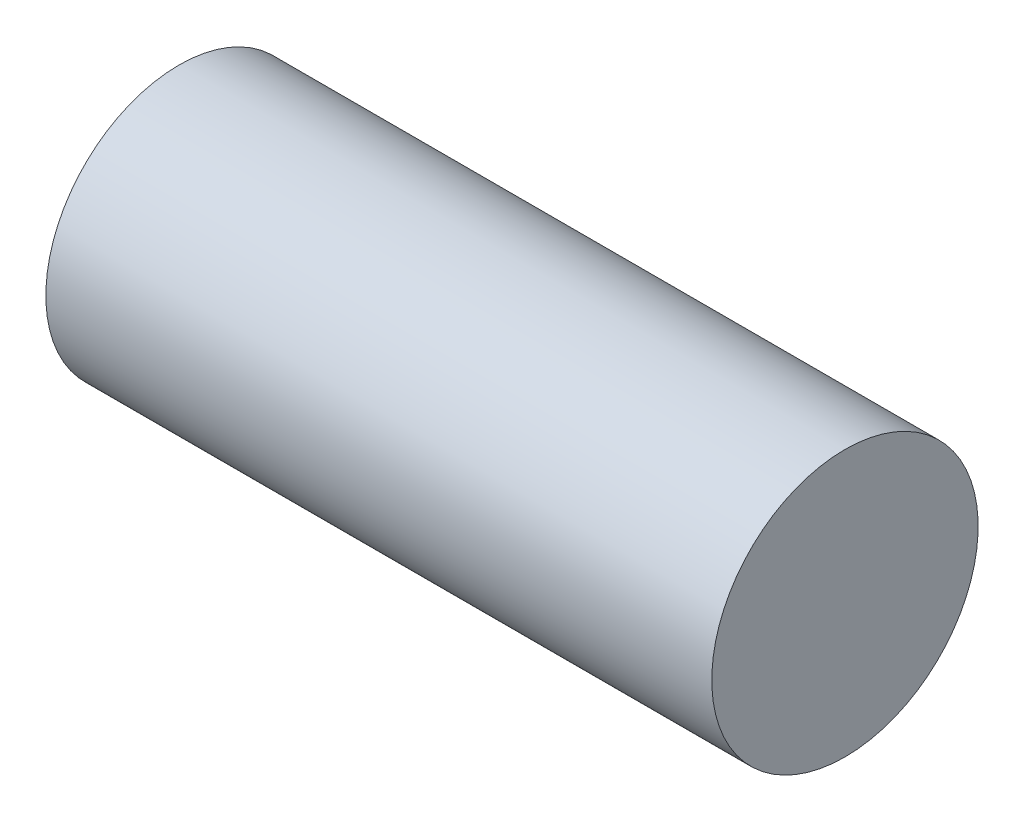
ISO-10303-21;
HEADER;
FILE_DESCRIPTION(('STEP AP214'),'2;1');
FILE_NAME('part.step','',(''),(''),'','','');
FILE_SCHEMA(('AUTOMOTIVE_DESIGN { 1 0 10303 214 1 1 1 1 }'));
ENDSEC;
DATA;
#1=APPLICATION_CONTEXT('core data for automotive mechanical design processes');
#2=APPLICATION_PROTOCOL_DEFINITION('international standard','automotive_design',2000,#1);
#3=PRODUCT_CONTEXT('',#1,'mechanical');
#4=PRODUCT('Part','Part','',(#3));
#5=PRODUCT_RELATED_PRODUCT_CATEGORY('part','',(#4));
#6=PRODUCT_DEFINITION_FORMATION('','',#4);
#7=PRODUCT_DEFINITION_CONTEXT('part definition',#1,'design');
#8=PRODUCT_DEFINITION('design','',#6,#7);
#9=PRODUCT_DEFINITION_SHAPE('','',#8);
#10=(LENGTH_UNIT() NAMED_UNIT(*) SI_UNIT(.MILLI.,.METRE.));
#11=(NAMED_UNIT(*) PLANE_ANGLE_UNIT() SI_UNIT($,.RADIAN.));
#12=(NAMED_UNIT(*) SI_UNIT($,.STERADIAN.) SOLID_ANGLE_UNIT());
#13=UNCERTAINTY_MEASURE_WITH_UNIT(LENGTH_MEASURE(1.E-05),#10,'distance_accuracy_value','');
#14=(GEOMETRIC_REPRESENTATION_CONTEXT(3) GLOBAL_UNCERTAINTY_ASSIGNED_CONTEXT((#13)) GLOBAL_UNIT_ASSIGNED_CONTEXT((#10,
#11,#12)) REPRESENTATION_CONTEXT('',''));
#15=CARTESIAN_POINT('',(0.,0.,0.));
#16=DIRECTION('',(0.,0.,1.));
#17=DIRECTION('',(1.,0.,0.));
#18=AXIS2_PLACEMENT_3D('',#15,#16,#17);
#19=CARTESIAN_POINT('',(0.,0.,0.));
#20=DIRECTION('',(1.,0.,0.));
#21=DIRECTION('',(0.,1.,0.));
#22=AXIS2_PLACEMENT_3D('',#19,#20,#21);
#23=PLANE('',#22);
#24=CARTESIAN_POINT('',(0.,0.,0.));
#25=DIRECTION('',(1.,0.,0.));
#26=DIRECTION('',(0.,1.,0.));
#27=AXIS2_PLACEMENT_3D('',#24,#25,#26);
#28=CIRCLE('',#27,60.);
#29=CARTESIAN_POINT('',(0.,60.,0.));
#30=VERTEX_POINT('',#29);
#31=EDGE_CURVE('E10',#30,#30,#28,.T.);
#32=ORIENTED_EDGE('',*,*,#31,.F.);
#33=EDGE_LOOP('',(#32));
#34=FACE_BOUND('',#33,.T.);
#35=ADVANCED_FACE('F33',(#34),#23,.F.);
#36=CARTESIAN_POINT('',(10.,0.,0.));
#37=DIRECTION('',(1.,0.,0.));
#38=DIRECTION('',(0.,1.,0.));
#39=AXIS2_PLACEMENT_3D('',#36,#37,#38);
#40=CYLINDRICAL_SURFACE('',#39,60.);
#41=CARTESIAN_POINT('',(300.,0.,0.));
#42=DIRECTION('',(1.,0.,0.));
#43=DIRECTION('',(0.,1.,0.));
#44=AXIS2_PLACEMENT_3D('',#41,#42,#43);
#45=CIRCLE('',#44,60.);
#46=CARTESIAN_POINT('',(300.,59.9999999999999,0.));
#47=VERTEX_POINT('',#46);
#48=EDGE_CURVE('E41',#47,#47,#45,.T.);
#49=ORIENTED_EDGE('',*,*,#48,.F.);
#50=EDGE_LOOP('',(#49));
#51=FACE_BOUND('',#50,.T.);
#52=ORIENTED_EDGE('',*,*,#31,.T.);
#53=EDGE_LOOP('',(#52));
#54=FACE_BOUND('',#53,.T.);
#55=ADVANCED_FACE('F111',(#51,#54),#40,.T.);
#56=CARTESIAN_POINT('',(300.,0.,0.));
#57=DIRECTION('',(1.,0.,0.));
#58=DIRECTION('',(0.,1.,0.));
#59=AXIS2_PLACEMENT_3D('',#56,#57,#58);
#60=PLANE('',#59);
#61=ORIENTED_EDGE('',*,*,#48,.T.);
#62=EDGE_LOOP('',(#61));
#63=FACE_BOUND('',#62,.T.);
#64=ADVANCED_FACE('F109',(#63),#60,.T.);
#65=CLOSED_SHELL('',(#35,#55,#64));
#66=CARTESIAN_POINT('',(10.,0.,0.));
#67=DIRECTION('',(-1.,0.,0.));
#68=DIRECTION('',(0.,-1.,0.));
#69=AXIS2_PLACEMENT_3D('',#66,#67,#68);
#70=PLANE('',#69);
#71=CARTESIAN_POINT('',(10.,0.,0.));
#72=DIRECTION('',(1.,0.,0.));
#73=DIRECTION('',(0.,1.,0.));
#74=AXIS2_PLACEMENT_3D('',#71,#72,#73);
#75=CIRCLE('',#74,50.);
#76=CARTESIAN_POINT('',(10.,50.,0.));
#77=VERTEX_POINT('',#76);
#78=EDGE_CURVE('E63',#77,#77,#75,.T.);
#79=ORIENTED_EDGE('',*,*,#78,.T.);
#80=EDGE_LOOP('',(#79));
#81=FACE_BOUND('',#80,.T.);
#82=ADVANCED_FACE('F35',(#81),#70,.F.);
#83=CARTESIAN_POINT('',(290.,0.,0.));
#84=DIRECTION('',(-1.,0.,0.));
#85=DIRECTION('',(0.,-1.,0.));
#86=AXIS2_PLACEMENT_3D('',#83,#84,#85);
#87=PLANE('',#86);
#88=CARTESIAN_POINT('',(290.,0.,0.));
#89=DIRECTION('',(1.,0.,0.));
#90=DIRECTION('',(0.,1.,0.));
#91=AXIS2_PLACEMENT_3D('',#88,#89,#90);
#92=CIRCLE('',#91,50.);
#93=CARTESIAN_POINT('',(290.,50.,0.));
#94=VERTEX_POINT('',#93);
#95=EDGE_CURVE('E45',#94,#94,#92,.T.);
#96=ORIENTED_EDGE('',*,*,#95,.F.);
#97=EDGE_LOOP('',(#96));
#98=FACE_BOUND('',#97,.T.);
#99=ADVANCED_FACE('F95',(#98),#87,.T.);
#100=CARTESIAN_POINT('',(10.,0.,0.));
#101=DIRECTION('',(1.,0.,0.));
#102=DIRECTION('',(0.,1.,0.));
#103=AXIS2_PLACEMENT_3D('',#100,#101,#102);
#104=CYLINDRICAL_SURFACE('',#103,50.);
#105=ORIENTED_EDGE('',*,*,#95,.T.);
#106=EDGE_LOOP('',(#105));
#107=FACE_BOUND('',#106,.T.);
#108=CARTESIAN_POINT('',(200.,0.,0.));
#109=DIRECTION('',(1.,0.,0.));
#110=DIRECTION('',(0.,1.,0.));
#111=AXIS2_PLACEMENT_3D('',#108,#109,#110);
#112=CIRCLE('',#111,50.);
#113=CARTESIAN_POINT('',(200.,50.,0.));
#114=VERTEX_POINT('',#113);
#115=EDGE_CURVE('E49',#114,#114,#112,.T.);
#116=ORIENTED_EDGE('',*,*,#115,.F.);
#117=EDGE_LOOP('',(#116));
#118=FACE_BOUND('',#117,.T.);
#119=ADVANCED_FACE('F89',(#107,#118),#104,.F.);
#120=CARTESIAN_POINT('',(160.,0.,0.));
#121=DIRECTION('',(1.,0.,0.));
#122=DIRECTION('',(0.,1.,0.));
#123=AXIS2_PLACEMENT_3D('',#120,#121,#122);
#124=CONICAL_SURFACE('',#123,9.99999999999998,0.78539816339745);
#125=CARTESIAN_POINT('',(160.,0.,0.));
#126=DIRECTION('',(1.,0.,0.));
#127=DIRECTION('',(0.,1.,0.));
#128=AXIS2_PLACEMENT_3D('',#125,#126,#127);
#129=CIRCLE('',#128,9.99999999999998);
#130=CARTESIAN_POINT('',(160.,9.99999999999998,0.));
#131=VERTEX_POINT('',#130);
#132=EDGE_CURVE('E54',#131,#131,#129,.T.);
#133=CARTESIAN_POINT('',(200.,50.,0.));
#134=CARTESIAN_POINT('',(199.583333333333,49.5833333333333,0.));
#135=CARTESIAN_POINT('',(199.166666666667,49.1666666666666,0.));
#136=CARTESIAN_POINT('',(198.333333333333,48.3333333333333,0.));
#137=CARTESIAN_POINT('',(197.916666666667,47.9166666666666,0.));
#138=CARTESIAN_POINT('',(197.083333333333,47.0833333333333,0.));
#139=CARTESIAN_POINT('',(196.666666666667,46.6666666666666,0.));
#140=CARTESIAN_POINT('',(195.833333333333,45.8333333333333,0.));
#141=CARTESIAN_POINT('',(195.416666666667,45.4166666666666,0.));
#142=CARTESIAN_POINT('',(194.583333333333,44.5833333333333,0.));
#143=CARTESIAN_POINT('',(194.166666666667,44.1666666666666,0.));
#144=CARTESIAN_POINT('',(193.333333333333,43.3333333333333,0.));
#145=CARTESIAN_POINT('',(192.916666666667,42.9166666666666,0.));
#146=CARTESIAN_POINT('',(192.083333333333,42.0833333333333,0.));
#147=CARTESIAN_POINT('',(191.666666666667,41.6666666666666,0.));
#148=CARTESIAN_POINT('',(190.833333333333,40.8333333333333,0.));
#149=CARTESIAN_POINT('',(190.416666666667,40.4166666666666,0.));
#150=CARTESIAN_POINT('',(189.583333333333,39.5833333333333,0.));
#151=CARTESIAN_POINT('',(189.166666666667,39.1666666666666,0.));
#152=CARTESIAN_POINT('',(188.333333333333,38.3333333333333,0.));
#153=CARTESIAN_POINT('',(187.916666666667,37.9166666666667,0.));
#154=CARTESIAN_POINT('',(187.083333333333,37.0833333333333,0.));
#155=CARTESIAN_POINT('',(186.666666666667,36.6666666666666,0.));
#156=CARTESIAN_POINT('',(185.833333333333,35.8333333333333,0.));
#157=CARTESIAN_POINT('',(185.416666666667,35.4166666666666,0.));
#158=CARTESIAN_POINT('',(184.583333333333,34.5833333333333,0.));
#159=CARTESIAN_POINT('',(184.166666666667,34.1666666666666,0.));
#160=CARTESIAN_POINT('',(183.333333333333,33.3333333333333,0.));
#161=CARTESIAN_POINT('',(182.916666666667,32.9166666666666,0.));
#162=CARTESIAN_POINT('',(182.083333333333,32.0833333333333,0.));
#163=CARTESIAN_POINT('',(181.666666666667,31.6666666666666,0.));
#164=CARTESIAN_POINT('',(180.833333333333,30.8333333333333,0.));
#165=CARTESIAN_POINT('',(180.416666666667,30.4166666666666,0.));
#166=CARTESIAN_POINT('',(179.583333333333,29.5833333333333,0.));
#167=CARTESIAN_POINT('',(179.166666666667,29.1666666666666,0.));
#168=CARTESIAN_POINT('',(178.333333333333,28.3333333333333,0.));
#169=CARTESIAN_POINT('',(177.916666666667,27.9166666666666,0.));
#170=CARTESIAN_POINT('',(177.083333333333,27.0833333333333,0.));
#171=CARTESIAN_POINT('',(176.666666666667,26.6666666666666,0.));
#172=CARTESIAN_POINT('',(175.833333333333,25.8333333333333,0.));
#173=CARTESIAN_POINT('',(175.416666666667,25.4166666666666,0.));
#174=CARTESIAN_POINT('',(174.583333333333,24.5833333333333,0.));
#175=CARTESIAN_POINT('',(174.166666666667,24.1666666666666,0.));
#176=CARTESIAN_POINT('',(173.333333333333,23.3333333333333,0.));
#177=CARTESIAN_POINT('',(172.916666666667,22.9166666666666,0.));
#178=CARTESIAN_POINT('',(172.083333333333,22.0833333333333,0.));
#179=CARTESIAN_POINT('',(171.666666666667,21.6666666666666,0.));
#180=CARTESIAN_POINT('',(170.833333333333,20.8333333333333,0.));
#181=CARTESIAN_POINT('',(170.416666666667,20.4166666666666,0.));
#182=CARTESIAN_POINT('',(169.583333333333,19.5833333333333,0.));
#183=CARTESIAN_POINT('',(169.166666666667,19.1666666666666,0.));
#184=CARTESIAN_POINT('',(168.333333333333,18.3333333333333,0.));
#185=CARTESIAN_POINT('',(167.916666666667,17.9166666666666,0.));
#186=CARTESIAN_POINT('',(167.083333333333,17.0833333333333,0.));
#187=CARTESIAN_POINT('',(166.666666666667,16.6666666666666,0.));
#188=CARTESIAN_POINT('',(165.833333333333,15.8333333333333,0.));
#189=CARTESIAN_POINT('',(165.416666666667,15.4166666666666,0.));
#190=CARTESIAN_POINT('',(164.583333333333,14.5833333333333,0.));
#191=CARTESIAN_POINT('',(164.166666666667,14.1666666666666,0.));
#192=CARTESIAN_POINT('',(163.333333333333,13.3333333333333,0.));
#193=CARTESIAN_POINT('',(162.916666666667,12.9166666666666,0.));
#194=CARTESIAN_POINT('',(162.083333333333,12.0833333333333,0.));
#195=CARTESIAN_POINT('',(161.666666666667,11.6666666666666,0.));
#196=CARTESIAN_POINT('',(160.833333333333,10.8333333333333,0.));
#197=CARTESIAN_POINT('',(160.416666666667,10.4166666666666,0.));
#198=CARTESIAN_POINT('',(160.,9.99999999999998,0.));
#199=B_SPLINE_CURVE_WITH_KNOTS('',3,(#133,#134,#135,#136,#137,#138,#139,#140,#141,#142,#143,
#144,#145,#146,#147,#148,#149,#150,#151,#152,#153,#154,#155,#156,#157,#158,#159,#160,#161,#162,
#163,#164,#165,#166,#167,#168,#169,#170,#171,#172,#173,#174,#175,#176,#177,#178,#179,#180,#181,
#182,#183,#184,#185,#186,#187,#188,#189,#190,#191,#192,#193,#194,#195,#196,#197,#198),
.UNSPECIFIED.,.F.,.F.,(4,2,2,2,2,2,2,2,2,2,2,2,2,2,2,2,2,2,2,2,2,2,2,2,2,2,2,2,2,2,2,2,4),(0.,
1.76776695296637,3.53553390593274,5.30330085889911,7.07106781186548,8.83883476483182,
10.6066017177982,12.3743686707646,14.1421356237309,15.9099025766973,17.6776695296636,
19.44543648263,21.2132034355964,22.9809703885627,24.7487373415291,26.5165042944955,
28.2842712474618,30.0520382004282,31.8198051533946,33.5875721063609,35.3553390593273,
37.1231060122937,38.89087296526,40.6586399182264,42.4264068711927,44.1941738241591,
45.9619407771255,47.7297077300919,49.4974746830582,51.2652416360246,53.0330085889909,
54.8007755419573,56.5685424949237),.UNSPECIFIED.);
#200=EDGE_CURVE('BSEAM84',#114,#131,#199,.T.);
#201=ORIENTED_EDGE('',*,*,#115,.T.);
#202=ORIENTED_EDGE('',*,*,#132,.F.);
#203=ORIENTED_EDGE('',*,*,#200,.T.);
#204=ORIENTED_EDGE('',*,*,#200,.F.);
#205=EDGE_LOOP('',(#201,#203,#202,#204));
#206=FACE_BOUND('',#205,.T.);
#207=ADVANCED_FACE('F84',(#206),#124,.F.);
#208=CARTESIAN_POINT('',(10.,0.,0.));
#209=DIRECTION('',(1.,0.,0.));
#210=DIRECTION('',(0.,1.,0.));
#211=AXIS2_PLACEMENT_3D('',#208,#209,#210);
#212=CYLINDRICAL_SURFACE('',#211,9.99999999999998);
#213=CARTESIAN_POINT('',(140.,0.,0.));
#214=DIRECTION('',(1.,0.,0.));
#215=DIRECTION('',(0.,1.,0.));
#216=AXIS2_PLACEMENT_3D('',#213,#214,#215);
#217=CIRCLE('',#216,9.99999999999998);
#218=CARTESIAN_POINT('',(140.,-10.,0.));
#219=VERTEX_POINT('',#218);
#220=EDGE_CURVE('E57',#219,#219,#217,.T.);
#221=ORIENTED_EDGE('',*,*,#220,.F.);
#222=EDGE_LOOP('',(#221));
#223=FACE_BOUND('',#222,.T.);
#224=ORIENTED_EDGE('',*,*,#132,.T.);
#225=EDGE_LOOP('',(#224));
#226=FACE_BOUND('',#225,.T.);
#227=ADVANCED_FACE('F78',(#223,#226),#212,.F.);
#228=CARTESIAN_POINT('',(140.,0.,0.));
#229=DIRECTION('',(-1.,0.,0.));
#230=DIRECTION('',(0.,-1.,0.));
#231=AXIS2_PLACEMENT_3D('',#228,#229,#230);
#232=CONICAL_SURFACE('',#231,9.99999999999998,0.78539816339745);
#233=CARTESIAN_POINT('',(100.,0.,0.));
#234=DIRECTION('',(1.,0.,0.));
#235=DIRECTION('',(0.,1.,0.));
#236=AXIS2_PLACEMENT_3D('',#233,#234,#235);
#237=CIRCLE('',#236,50.);
#238=CARTESIAN_POINT('',(100.,-50.,0.));
#239=VERTEX_POINT('',#238);
#240=EDGE_CURVE('E60',#239,#239,#237,.T.);
#241=CARTESIAN_POINT('',(100.,-50.,0.));
#242=CARTESIAN_POINT('',(100.416666666667,-49.5833333333333,0.));
#243=CARTESIAN_POINT('',(100.833333333333,-49.1666666666667,0.));
#244=CARTESIAN_POINT('',(101.666666666667,-48.3333333333333,0.));
#245=CARTESIAN_POINT('',(102.083333333333,-47.9166666666667,0.));
#246=CARTESIAN_POINT('',(102.916666666667,-47.0833333333333,0.));
#247=CARTESIAN_POINT('',(103.333333333333,-46.6666666666667,0.));
#248=CARTESIAN_POINT('',(104.166666666667,-45.8333333333333,0.));
#249=CARTESIAN_POINT('',(104.583333333333,-45.4166666666667,0.));
#250=CARTESIAN_POINT('',(105.416666666667,-44.5833333333333,0.));
#251=CARTESIAN_POINT('',(105.833333333333,-44.1666666666667,0.));
#252=CARTESIAN_POINT('',(106.666666666667,-43.3333333333333,0.));
#253=CARTESIAN_POINT('',(107.083333333333,-42.9166666666667,0.));
#254=CARTESIAN_POINT('',(107.916666666667,-42.0833333333333,0.));
#255=CARTESIAN_POINT('',(108.333333333333,-41.6666666666667,0.));
#256=CARTESIAN_POINT('',(109.166666666667,-40.8333333333333,0.));
#257=CARTESIAN_POINT('',(109.583333333333,-40.4166666666667,0.));
#258=CARTESIAN_POINT('',(110.416666666667,-39.5833333333333,0.));
#259=CARTESIAN_POINT('',(110.833333333333,-39.1666666666667,0.));
#260=CARTESIAN_POINT('',(111.666666666667,-38.3333333333333,0.));
#261=CARTESIAN_POINT('',(112.083333333333,-37.9166666666667,0.));
#262=CARTESIAN_POINT('',(112.916666666667,-37.0833333333333,0.));
#263=CARTESIAN_POINT('',(113.333333333333,-36.6666666666667,0.));
#264=CARTESIAN_POINT('',(114.166666666667,-35.8333333333333,0.));
#265=CARTESIAN_POINT('',(114.583333333333,-35.4166666666667,0.));
#266=CARTESIAN_POINT('',(115.416666666667,-34.5833333333333,0.));
#267=CARTESIAN_POINT('',(115.833333333333,-34.1666666666667,0.));
#268=CARTESIAN_POINT('',(116.666666666667,-33.3333333333333,0.));
#269=CARTESIAN_POINT('',(117.083333333333,-32.9166666666667,0.));
#270=CARTESIAN_POINT('',(117.916666666667,-32.0833333333333,0.));
#271=CARTESIAN_POINT('',(118.333333333333,-31.6666666666667,0.));
#272=CARTESIAN_POINT('',(119.166666666667,-30.8333333333333,0.));
#273=CARTESIAN_POINT('',(119.583333333333,-30.4166666666667,0.));
#274=CARTESIAN_POINT('',(120.416666666667,-29.5833333333333,0.));
#275=CARTESIAN_POINT('',(120.833333333333,-29.1666666666667,0.));
#276=CARTESIAN_POINT('',(121.666666666667,-28.3333333333333,0.));
#277=CARTESIAN_POINT('',(122.083333333333,-27.9166666666667,0.));
#278=CARTESIAN_POINT('',(122.916666666667,-27.0833333333333,0.));
#279=CARTESIAN_POINT('',(123.333333333333,-26.6666666666667,0.));
#280=CARTESIAN_POINT('',(124.166666666667,-25.8333333333333,0.));
#281=CARTESIAN_POINT('',(124.583333333333,-25.4166666666667,0.));
#282=CARTESIAN_POINT('',(125.416666666667,-24.5833333333333,0.));
#283=CARTESIAN_POINT('',(125.833333333333,-24.1666666666667,0.));
#284=CARTESIAN_POINT('',(126.666666666667,-23.3333333333333,0.));
#285=CARTESIAN_POINT('',(127.083333333333,-22.9166666666667,0.));
#286=CARTESIAN_POINT('',(127.916666666667,-22.0833333333333,0.));
#287=CARTESIAN_POINT('',(128.333333333333,-21.6666666666667,0.));
#288=CARTESIAN_POINT('',(129.166666666667,-20.8333333333333,0.));
#289=CARTESIAN_POINT('',(129.583333333333,-20.4166666666667,0.));
#290=CARTESIAN_POINT('',(130.416666666667,-19.5833333333333,0.));
#291=CARTESIAN_POINT('',(130.833333333333,-19.1666666666667,0.));
#292=CARTESIAN_POINT('',(131.666666666667,-18.3333333333333,0.));
#293=CARTESIAN_POINT('',(132.083333333333,-17.9166666666667,0.));
#294=CARTESIAN_POINT('',(132.916666666667,-17.0833333333333,0.));
#295=CARTESIAN_POINT('',(133.333333333333,-16.6666666666667,0.));
#296=CARTESIAN_POINT('',(134.166666666667,-15.8333333333333,0.));
#297=CARTESIAN_POINT('',(134.583333333333,-15.4166666666667,0.));
#298=CARTESIAN_POINT('',(135.416666666667,-14.5833333333333,0.));
#299=CARTESIAN_POINT('',(135.833333333333,-14.1666666666667,0.));
#300=CARTESIAN_POINT('',(136.666666666667,-13.3333333333333,0.));
#301=CARTESIAN_POINT('',(137.083333333333,-12.9166666666667,0.));
#302=CARTESIAN_POINT('',(137.916666666667,-12.0833333333333,0.));
#303=CARTESIAN_POINT('',(138.333333333333,-11.6666666666667,0.));
#304=CARTESIAN_POINT('',(139.166666666667,-10.8333333333333,0.));
#305=CARTESIAN_POINT('',(139.583333333333,-10.4166666666667,0.));
#306=CARTESIAN_POINT('',(140.,-10.,0.));
#307=B_SPLINE_CURVE_WITH_KNOTS('',3,(#241,#242,#243,#244,#245,#246,#247,#248,#249,#250,#251,
#252,#253,#254,#255,#256,#257,#258,#259,#260,#261,#262,#263,#264,#265,#266,#267,#268,#269,#270,
#271,#272,#273,#274,#275,#276,#277,#278,#279,#280,#281,#282,#283,#284,#285,#286,#287,#288,#289,
#290,#291,#292,#293,#294,#295,#296,#297,#298,#299,#300,#301,#302,#303,#304,#305,#306),
.UNSPECIFIED.,.F.,.F.,(4,2,2,2,2,2,2,2,2,2,2,2,2,2,2,2,2,2,2,2,2,2,2,2,2,2,2,2,2,2,2,2,4),(0.,
1.76776695296636,3.53553390593273,5.3033008588991,7.07106781186545,8.83883476483181,
10.6066017177982,12.3743686707645,14.1421356237309,15.9099025766973,17.6776695296636,
19.44543648263,21.2132034355964,22.9809703885627,24.7487373415291,26.5165042944955,
28.2842712474618,30.0520382004282,31.8198051533945,33.5875721063609,35.3553390593273,
37.1231060122936,38.89087296526,40.6586399182264,42.4264068711927,44.1941738241591,
45.9619407771255,47.7297077300918,49.4974746830582,51.2652416360245,53.0330085889909,
54.8007755419573,56.5685424949236),.UNSPECIFIED.);
#308=EDGE_CURVE('BSEAM71',#239,#219,#307,.T.);
#309=ORIENTED_EDGE('',*,*,#240,.F.);
#310=ORIENTED_EDGE('',*,*,#220,.T.);
#311=ORIENTED_EDGE('',*,*,#308,.T.);
#312=ORIENTED_EDGE('',*,*,#308,.F.);
#313=EDGE_LOOP('',(#309,#311,#310,#312));
#314=FACE_BOUND('',#313,.T.);
#315=ADVANCED_FACE('F71',(#314),#232,.F.);
#316=CARTESIAN_POINT('',(10.,0.,0.));
#317=DIRECTION('',(1.,0.,0.));
#318=DIRECTION('',(0.,1.,0.));
#319=AXIS2_PLACEMENT_3D('',#316,#317,#318);
#320=CYLINDRICAL_SURFACE('',#319,50.);
#321=ORIENTED_EDGE('',*,*,#78,.F.);
#322=EDGE_LOOP('',(#321));
#323=FACE_BOUND('',#322,.T.);
#324=ORIENTED_EDGE('',*,*,#240,.T.);
#325=EDGE_LOOP('',(#324));
#326=FACE_BOUND('',#325,.T.);
#327=ADVANCED_FACE('F68',(#323,#326),#320,.F.);
#328=CLOSED_SHELL('',(#82,#99,#119,#207,#227,#315,#327));
#329=ORIENTED_CLOSED_SHELL('',*,#328,.T.);
#330=BREP_WITH_VOIDS('B2',#65,(#329));
#331=ADVANCED_BREP_SHAPE_REPRESENTATION('',(#18,#330),#14);
#332=SHAPE_DEFINITION_REPRESENTATION(#9,#331);
ENDSEC;
END-ISO-10303-21;
